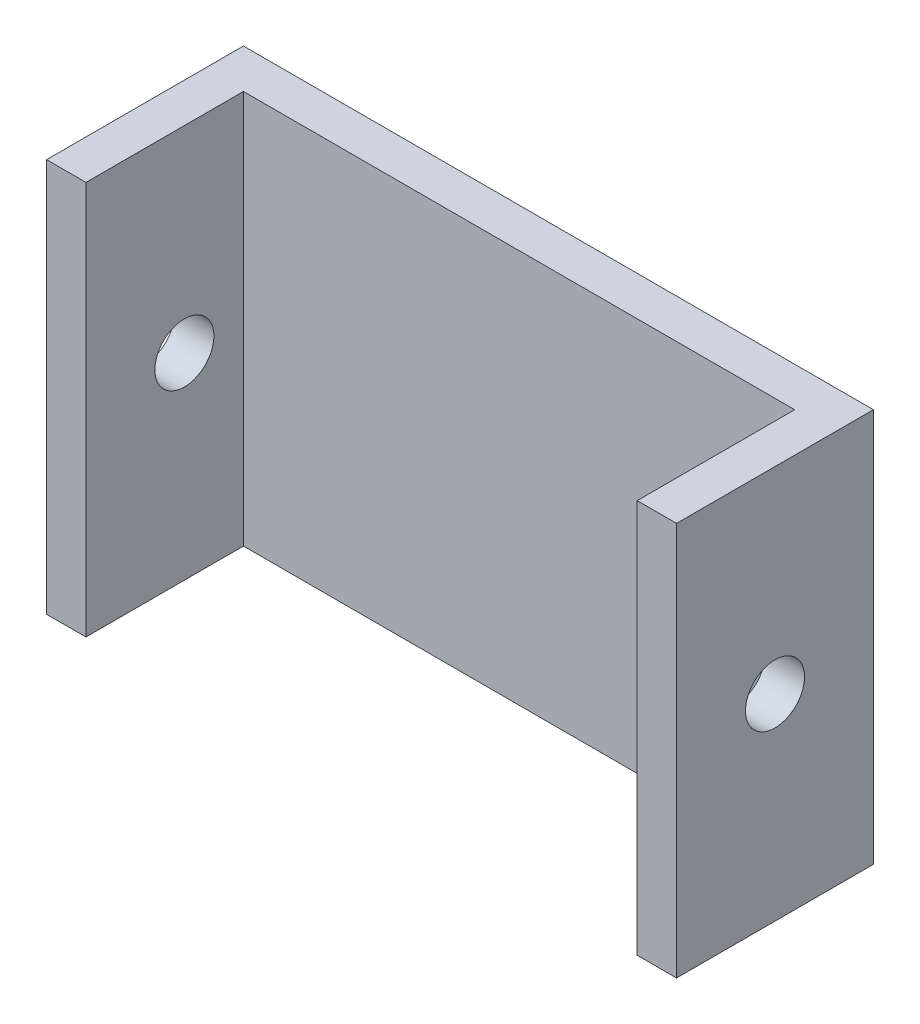
ISO-10303-21;
HEADER;
FILE_DESCRIPTION(('STEP AP214'),'2;1');
FILE_NAME('part.step','',(''),(''),'','','');
FILE_SCHEMA(('AUTOMOTIVE_DESIGN { 1 0 10303 214 1 1 1 1 }'));
ENDSEC;
DATA;
#1=APPLICATION_CONTEXT('core data for automotive mechanical design processes');
#2=APPLICATION_PROTOCOL_DEFINITION('international standard','automotive_design',2000,#1);
#3=PRODUCT_CONTEXT('',#1,'mechanical');
#4=PRODUCT('Part','Part','',(#3));
#5=PRODUCT_RELATED_PRODUCT_CATEGORY('part','',(#4));
#6=PRODUCT_DEFINITION_FORMATION('','',#4);
#7=PRODUCT_DEFINITION_CONTEXT('part definition',#1,'design');
#8=PRODUCT_DEFINITION('design','',#6,#7);
#9=PRODUCT_DEFINITION_SHAPE('','',#8);
#10=(LENGTH_UNIT() NAMED_UNIT(*) SI_UNIT(.MILLI.,.METRE.));
#11=(NAMED_UNIT(*) PLANE_ANGLE_UNIT() SI_UNIT($,.RADIAN.));
#12=(NAMED_UNIT(*) SI_UNIT($,.STERADIAN.) SOLID_ANGLE_UNIT());
#13=UNCERTAINTY_MEASURE_WITH_UNIT(LENGTH_MEASURE(1.E-05),#10,'distance_accuracy_value','');
#14=(GEOMETRIC_REPRESENTATION_CONTEXT(3) GLOBAL_UNCERTAINTY_ASSIGNED_CONTEXT((#13)) GLOBAL_UNIT_ASSIGNED_CONTEXT((#10,
#11,#12)) REPRESENTATION_CONTEXT('',''));
#15=CARTESIAN_POINT('',(0.,0.,0.));
#16=DIRECTION('',(0.,0.,1.));
#17=DIRECTION('',(1.,0.,0.));
#18=AXIS2_PLACEMENT_3D('',#15,#16,#17);
#19=CARTESIAN_POINT('',(-14.,10.,2.));
#20=DIRECTION('',(0.,-1.,0.));
#21=DIRECTION('',(0.,0.,-1.));
#22=AXIS2_PLACEMENT_3D('',#19,#20,#21);
#23=PLANE('',#22);
#24=DIRECTION('',(-1.,0.,0.));
#25=VECTOR('',#24,1.);
#26=CARTESIAN_POINT('',(-14.,10.,0.));
#27=LINE('',#26,#25);
#28=CARTESIAN_POINT('',(16.,10.,0.));
#29=VERTEX_POINT('',#28);
#30=CARTESIAN_POINT('',(-16.,10.,0.));
#31=VERTEX_POINT('',#30);
#32=EDGE_CURVE('E147',#29,#31,#27,.T.);
#33=ORIENTED_EDGE('',*,*,#32,.T.);
#34=DIRECTION('',(0.,0.,-1.));
#35=VECTOR('',#34,1.);
#36=CARTESIAN_POINT('',(-16.,10.,10.));
#37=LINE('',#36,#35);
#38=CARTESIAN_POINT('',(-16.,10.,10.));
#39=VERTEX_POINT('',#38);
#40=EDGE_CURVE('E141',#39,#31,#37,.T.);
#41=ORIENTED_EDGE('',*,*,#40,.F.);
#42=DIRECTION('',(-1.,0.,0.));
#43=VECTOR('',#42,1.);
#44=CARTESIAN_POINT('',(-16.,10.,10.));
#45=LINE('',#44,#43);
#46=CARTESIAN_POINT('',(-14.,10.,10.));
#47=VERTEX_POINT('',#46);
#48=EDGE_CURVE('E131',#47,#39,#45,.T.);
#49=ORIENTED_EDGE('',*,*,#48,.F.);
#50=DIRECTION('',(0.,0.,-1.));
#51=VECTOR('',#50,1.);
#52=CARTESIAN_POINT('',(-14.,10.,10.));
#53=LINE('',#52,#51);
#54=CARTESIAN_POINT('',(-14.,10.,2.));
#55=VERTEX_POINT('',#54);
#56=EDGE_CURVE('E144',#47,#55,#53,.T.);
#57=ORIENTED_EDGE('',*,*,#56,.T.);
#58=DIRECTION('',(-1.,0.,0.));
#59=VECTOR('',#58,1.);
#60=CARTESIAN_POINT('',(-14.,10.,2.));
#61=LINE('',#60,#59);
#62=CARTESIAN_POINT('',(14.,10.,2.));
#63=VERTEX_POINT('',#62);
#64=EDGE_CURVE('E151',#63,#55,#61,.T.);
#65=ORIENTED_EDGE('',*,*,#64,.F.);
#66=DIRECTION('',(0.,0.,-1.));
#67=VECTOR('',#66,1.);
#68=CARTESIAN_POINT('',(14.,10.,10.));
#69=LINE('',#68,#67);
#70=CARTESIAN_POINT('',(14.,10.,10.));
#71=VERTEX_POINT('',#70);
#72=EDGE_CURVE('E57',#71,#63,#69,.T.);
#73=ORIENTED_EDGE('',*,*,#72,.F.);
#74=DIRECTION('',(-1.,0.,0.));
#75=VECTOR('',#74,1.);
#76=CARTESIAN_POINT('',(16.,10.,10.));
#77=LINE('',#76,#75);
#78=CARTESIAN_POINT('',(16.,10.,10.));
#79=VERTEX_POINT('',#78);
#80=EDGE_CURVE('E100',#79,#71,#77,.T.);
#81=ORIENTED_EDGE('',*,*,#80,.F.);
#82=DIRECTION('',(0.,0.,-1.));
#83=VECTOR('',#82,1.);
#84=CARTESIAN_POINT('',(16.,10.,10.));
#85=LINE('',#84,#83);
#86=EDGE_CURVE('E103',#79,#29,#85,.T.);
#87=ORIENTED_EDGE('',*,*,#86,.T.);
#88=EDGE_LOOP('',(#33,#41,#49,#57,#65,#73,#81,#87));
#89=FACE_BOUND('',#88,.T.);
#90=ADVANCED_FACE('F33',(#89),#23,.F.);
#91=CARTESIAN_POINT('',(-14.,-10.,2.));
#92=DIRECTION('',(0.,1.,0.));
#93=DIRECTION('',(0.,0.,1.));
#94=AXIS2_PLACEMENT_3D('',#91,#92,#93);
#95=PLANE('',#94);
#96=DIRECTION('',(1.,0.,0.));
#97=VECTOR('',#96,1.);
#98=CARTESIAN_POINT('',(-14.,-10.,0.));
#99=LINE('',#98,#97);
#100=CARTESIAN_POINT('',(-16.,-10.,0.));
#101=VERTEX_POINT('',#100);
#102=CARTESIAN_POINT('',(16.,-10.,0.));
#103=VERTEX_POINT('',#102);
#104=EDGE_CURVE('E152',#101,#103,#99,.T.);
#105=ORIENTED_EDGE('',*,*,#104,.T.);
#106=DIRECTION('',(0.,0.,-1.));
#107=VECTOR('',#106,1.);
#108=CARTESIAN_POINT('',(16.,-10.,10.));
#109=LINE('',#108,#107);
#110=CARTESIAN_POINT('',(16.,-10.,10.));
#111=VERTEX_POINT('',#110);
#112=EDGE_CURVE('E158',#111,#103,#109,.T.);
#113=ORIENTED_EDGE('',*,*,#112,.F.);
#114=DIRECTION('',(1.,0.,0.));
#115=VECTOR('',#114,1.);
#116=CARTESIAN_POINT('',(14.,-10.,10.));
#117=LINE('',#116,#115);
#118=CARTESIAN_POINT('',(14.,-10.,10.));
#119=VERTEX_POINT('',#118);
#120=EDGE_CURVE('E112',#119,#111,#117,.T.);
#121=ORIENTED_EDGE('',*,*,#120,.F.);
#122=DIRECTION('',(0.,0.,-1.));
#123=VECTOR('',#122,1.);
#124=CARTESIAN_POINT('',(14.,-10.,10.));
#125=LINE('',#124,#123);
#126=CARTESIAN_POINT('',(14.,-10.,2.));
#127=VERTEX_POINT('',#126);
#128=EDGE_CURVE('E125',#119,#127,#125,.T.);
#129=ORIENTED_EDGE('',*,*,#128,.T.);
#130=DIRECTION('',(1.,0.,0.));
#131=VECTOR('',#130,1.);
#132=CARTESIAN_POINT('',(-14.,-10.,2.));
#133=LINE('',#132,#131);
#134=CARTESIAN_POINT('',(-14.,-10.,2.));
#135=VERTEX_POINT('',#134);
#136=EDGE_CURVE('E11',#135,#127,#133,.T.);
#137=ORIENTED_EDGE('',*,*,#136,.F.);
#138=DIRECTION('',(0.,0.,-1.));
#139=VECTOR('',#138,1.);
#140=CARTESIAN_POINT('',(-14.,-10.,10.));
#141=LINE('',#140,#139);
#142=CARTESIAN_POINT('',(-14.,-10.,10.));
#143=VERTEX_POINT('',#142);
#144=EDGE_CURVE('E49',#143,#135,#141,.T.);
#145=ORIENTED_EDGE('',*,*,#144,.F.);
#146=DIRECTION('',(1.,0.,0.));
#147=VECTOR('',#146,1.);
#148=CARTESIAN_POINT('',(-14.,-10.,10.));
#149=LINE('',#148,#147);
#150=CARTESIAN_POINT('',(-16.,-10.,10.));
#151=VERTEX_POINT('',#150);
#152=EDGE_CURVE('E135',#151,#143,#149,.T.);
#153=ORIENTED_EDGE('',*,*,#152,.F.);
#154=DIRECTION('',(0.,0.,-1.));
#155=VECTOR('',#154,1.);
#156=CARTESIAN_POINT('',(-16.,-10.,10.));
#157=LINE('',#156,#155);
#158=EDGE_CURVE('E138',#151,#101,#157,.T.);
#159=ORIENTED_EDGE('',*,*,#158,.T.);
#160=EDGE_LOOP('',(#105,#113,#121,#129,#137,#145,#153,#159));
#161=FACE_BOUND('',#160,.T.);
#162=ADVANCED_FACE('F157',(#161),#95,.F.);
#163=CARTESIAN_POINT('',(0.,0.,2.));
#164=DIRECTION('',(0.,0.,1.));
#165=DIRECTION('',(1.,0.,0.));
#166=AXIS2_PLACEMENT_3D('',#163,#164,#165);
#167=PLANE('',#166);
#168=DIRECTION('',(0.,1.,0.));
#169=VECTOR('',#168,1.);
#170=CARTESIAN_POINT('',(14.,10.,2.));
#171=LINE('',#170,#169);
#172=EDGE_CURVE('E148',#127,#63,#171,.T.);
#173=ORIENTED_EDGE('',*,*,#172,.T.);
#174=ORIENTED_EDGE('',*,*,#64,.T.);
#175=DIRECTION('',(0.,-1.,0.));
#176=VECTOR('',#175,1.);
#177=CARTESIAN_POINT('',(-14.,10.,2.));
#178=LINE('',#177,#176);
#179=EDGE_CURVE('E41',#55,#135,#178,.T.);
#180=ORIENTED_EDGE('',*,*,#179,.T.);
#181=ORIENTED_EDGE('',*,*,#136,.T.);
#182=EDGE_LOOP('',(#173,#174,#180,#181));
#183=FACE_BOUND('',#182,.T.);
#184=ADVANCED_FACE('F175',(#183),#167,.T.);
#185=CARTESIAN_POINT('',(0.,0.,0.));
#186=DIRECTION('',(0.,0.,1.));
#187=DIRECTION('',(1.,0.,0.));
#188=AXIS2_PLACEMENT_3D('',#185,#186,#187);
#189=PLANE('',#188);
#190=ORIENTED_EDGE('',*,*,#32,.F.);
#191=DIRECTION('',(0.,1.,0.));
#192=VECTOR('',#191,1.);
#193=CARTESIAN_POINT('',(16.,-10.,0.));
#194=LINE('',#193,#192);
#195=EDGE_CURVE('E116',#103,#29,#194,.T.);
#196=ORIENTED_EDGE('',*,*,#195,.F.);
#197=ORIENTED_EDGE('',*,*,#104,.F.);
#198=DIRECTION('',(0.,-1.,0.));
#199=VECTOR('',#198,1.);
#200=CARTESIAN_POINT('',(-16.,-10.,0.));
#201=LINE('',#200,#199);
#202=EDGE_CURVE('E120',#31,#101,#201,.T.);
#203=ORIENTED_EDGE('',*,*,#202,.F.);
#204=EDGE_LOOP('',(#190,#196,#197,#203));
#205=FACE_BOUND('',#204,.T.);
#206=ADVANCED_FACE('F164',(#205),#189,.F.);
#207=CARTESIAN_POINT('',(-14.,10.,10.));
#208=DIRECTION('',(-1.,0.,0.));
#209=DIRECTION('',(0.,-1.,0.));
#210=AXIS2_PLACEMENT_3D('',#207,#208,#209);
#211=PLANE('',#210);
#212=CARTESIAN_POINT('',(-14.,0.,5.));
#213=DIRECTION('',(-1.,0.,0.));
#214=DIRECTION('',(0.,-1.,0.));
#215=AXIS2_PLACEMENT_3D('',#212,#213,#214);
#216=CIRCLE('',#215,1.5);
#217=CARTESIAN_POINT('',(-14.,-1.5,5.));
#218=VERTEX_POINT('',#217);
#219=EDGE_CURVE('E165',#218,#218,#216,.T.);
#220=ORIENTED_EDGE('',*,*,#219,.T.);
#221=EDGE_LOOP('',(#220));
#222=FACE_BOUND('',#221,.T.);
#223=ORIENTED_EDGE('',*,*,#179,.F.);
#224=ORIENTED_EDGE('',*,*,#56,.F.);
#225=DIRECTION('',(0.,1.,0.));
#226=VECTOR('',#225,1.);
#227=CARTESIAN_POINT('',(-14.,10.,10.));
#228=LINE('',#227,#226);
#229=EDGE_CURVE('E123',#143,#47,#228,.T.);
#230=ORIENTED_EDGE('',*,*,#229,.F.);
#231=ORIENTED_EDGE('',*,*,#144,.T.);
#232=EDGE_LOOP('',(#223,#224,#230,#231));
#233=FACE_BOUND('',#232,.T.);
#234=ADVANCED_FACE('F177',(#222,#233),#211,.F.);
#235=CARTESIAN_POINT('',(-16.,-10.,10.));
#236=DIRECTION('',(1.,0.,0.));
#237=DIRECTION('',(0.,1.,0.));
#238=AXIS2_PLACEMENT_3D('',#235,#236,#237);
#239=PLANE('',#238);
#240=CARTESIAN_POINT('',(-16.,0.,5.));
#241=DIRECTION('',(1.,0.,0.));
#242=DIRECTION('',(0.,0.,-1.));
#243=AXIS2_PLACEMENT_3D('',#240,#241,#242);
#244=CIRCLE('',#243,1.5);
#245=CARTESIAN_POINT('',(-16.,0.,3.5));
#246=VERTEX_POINT('',#245);
#247=EDGE_CURVE('E273',#246,#246,#244,.T.);
#248=ORIENTED_EDGE('',*,*,#247,.T.);
#249=EDGE_LOOP('',(#248));
#250=FACE_BOUND('',#249,.T.);
#251=ORIENTED_EDGE('',*,*,#202,.T.);
#252=ORIENTED_EDGE('',*,*,#158,.F.);
#253=DIRECTION('',(0.,-1.,0.));
#254=VECTOR('',#253,1.);
#255=CARTESIAN_POINT('',(-16.,-10.,10.));
#256=LINE('',#255,#254);
#257=EDGE_CURVE('E133',#39,#151,#256,.T.);
#258=ORIENTED_EDGE('',*,*,#257,.F.);
#259=ORIENTED_EDGE('',*,*,#40,.T.);
#260=EDGE_LOOP('',(#251,#252,#258,#259));
#261=FACE_BOUND('',#260,.T.);
#262=ADVANCED_FACE('F183',(#250,#261),#239,.F.);
#263=CARTESIAN_POINT('',(0.,0.,10.));
#264=DIRECTION('',(0.,0.,-1.));
#265=DIRECTION('',(-1.,0.,0.));
#266=AXIS2_PLACEMENT_3D('',#263,#264,#265);
#267=PLANE('',#266);
#268=ORIENTED_EDGE('',*,*,#229,.T.);
#269=ORIENTED_EDGE('',*,*,#48,.T.);
#270=ORIENTED_EDGE('',*,*,#257,.T.);
#271=ORIENTED_EDGE('',*,*,#152,.T.);
#272=EDGE_LOOP('',(#268,#269,#270,#271));
#273=FACE_BOUND('',#272,.T.);
#274=ADVANCED_FACE('F181',(#273),#267,.F.);
#275=CARTESIAN_POINT('',(16.,-10.,10.));
#276=DIRECTION('',(-1.,0.,0.));
#277=DIRECTION('',(0.,-1.,0.));
#278=AXIS2_PLACEMENT_3D('',#275,#276,#277);
#279=PLANE('',#278);
#280=CARTESIAN_POINT('',(16.,0.,5.));
#281=DIRECTION('',(1.,0.,0.));
#282=DIRECTION('',(0.,0.,-1.));
#283=AXIS2_PLACEMENT_3D('',#280,#281,#282);
#284=CIRCLE('',#283,1.5);
#285=CARTESIAN_POINT('',(16.,0.,3.5));
#286=VERTEX_POINT('',#285);
#287=EDGE_CURVE('E275',#286,#286,#284,.T.);
#288=ORIENTED_EDGE('',*,*,#287,.F.);
#289=EDGE_LOOP('',(#288));
#290=FACE_BOUND('',#289,.T.);
#291=ORIENTED_EDGE('',*,*,#195,.T.);
#292=ORIENTED_EDGE('',*,*,#86,.F.);
#293=DIRECTION('',(0.,1.,0.));
#294=VECTOR('',#293,1.);
#295=CARTESIAN_POINT('',(16.,-10.,10.));
#296=LINE('',#295,#294);
#297=EDGE_CURVE('E107',#111,#79,#296,.T.);
#298=ORIENTED_EDGE('',*,*,#297,.F.);
#299=ORIENTED_EDGE('',*,*,#112,.T.);
#300=EDGE_LOOP('',(#291,#292,#298,#299));
#301=FACE_BOUND('',#300,.T.);
#302=ADVANCED_FACE('F118',(#290,#301),#279,.F.);
#303=CARTESIAN_POINT('',(14.,10.,10.));
#304=DIRECTION('',(1.,0.,0.));
#305=DIRECTION('',(0.,1.,0.));
#306=AXIS2_PLACEMENT_3D('',#303,#304,#305);
#307=PLANE('',#306);
#308=CARTESIAN_POINT('',(14.,0.,5.));
#309=DIRECTION('',(1.,0.,0.));
#310=DIRECTION('',(0.,1.,0.));
#311=AXIS2_PLACEMENT_3D('',#308,#309,#310);
#312=CIRCLE('',#311,1.5);
#313=CARTESIAN_POINT('',(14.,1.5,5.));
#314=VERTEX_POINT('',#313);
#315=EDGE_CURVE('E36',#314,#314,#312,.T.);
#316=ORIENTED_EDGE('',*,*,#315,.T.);
#317=EDGE_LOOP('',(#316));
#318=FACE_BOUND('',#317,.T.);
#319=ORIENTED_EDGE('',*,*,#172,.F.);
#320=ORIENTED_EDGE('',*,*,#128,.F.);
#321=DIRECTION('',(0.,-1.,0.));
#322=VECTOR('',#321,1.);
#323=CARTESIAN_POINT('',(14.,10.,10.));
#324=LINE('',#323,#322);
#325=EDGE_CURVE('E106',#71,#119,#324,.T.);
#326=ORIENTED_EDGE('',*,*,#325,.F.);
#327=ORIENTED_EDGE('',*,*,#72,.T.);
#328=EDGE_LOOP('',(#319,#320,#326,#327));
#329=FACE_BOUND('',#328,.T.);
#330=ADVANCED_FACE('F231',(#318,#329),#307,.F.);
#331=CARTESIAN_POINT('',(0.,0.,10.));
#332=DIRECTION('',(0.,0.,1.));
#333=DIRECTION('',(1.,0.,0.));
#334=AXIS2_PLACEMENT_3D('',#331,#332,#333);
#335=PLANE('',#334);
#336=ORIENTED_EDGE('',*,*,#297,.T.);
#337=ORIENTED_EDGE('',*,*,#80,.T.);
#338=ORIENTED_EDGE('',*,*,#325,.T.);
#339=ORIENTED_EDGE('',*,*,#120,.T.);
#340=EDGE_LOOP('',(#336,#337,#338,#339));
#341=FACE_BOUND('',#340,.T.);
#342=ADVANCED_FACE('F110',(#341),#335,.T.);
#343=CARTESIAN_POINT('',(-16.,0.,5.));
#344=DIRECTION('',(1.,0.,0.));
#345=DIRECTION('',(0.,0.,-1.));
#346=AXIS2_PLACEMENT_3D('',#343,#344,#345);
#347=CYLINDRICAL_SURFACE('',#346,1.5);
#348=ORIENTED_EDGE('',*,*,#287,.T.);
#349=EDGE_LOOP('',(#348));
#350=FACE_BOUND('',#349,.T.);
#351=ORIENTED_EDGE('',*,*,#315,.F.);
#352=EDGE_LOOP('',(#351));
#353=FACE_BOUND('',#352,.T.);
#354=ADVANCED_FACE('F250',(#350,#353),#347,.F.);
#355=ORIENTED_EDGE('',*,*,#247,.F.);
#356=EDGE_LOOP('',(#355));
#357=FACE_BOUND('',#356,.T.);
#358=ORIENTED_EDGE('',*,*,#219,.F.);
#359=EDGE_LOOP('',(#358));
#360=FACE_BOUND('',#359,.T.);
#361=ADVANCED_FACE('F255',(#357,#360),#347,.F.);
#362=CLOSED_SHELL('',(#90,#162,#184,#206,#234,#262,#274,#302,#330,#342,#354,#361));
#363=MANIFOLD_SOLID_BREP('B2',#362);
#364=ADVANCED_BREP_SHAPE_REPRESENTATION('',(#18,#363),#14);
#365=SHAPE_DEFINITION_REPRESENTATION(#9,#364);
ENDSEC;
END-ISO-10303-21;
